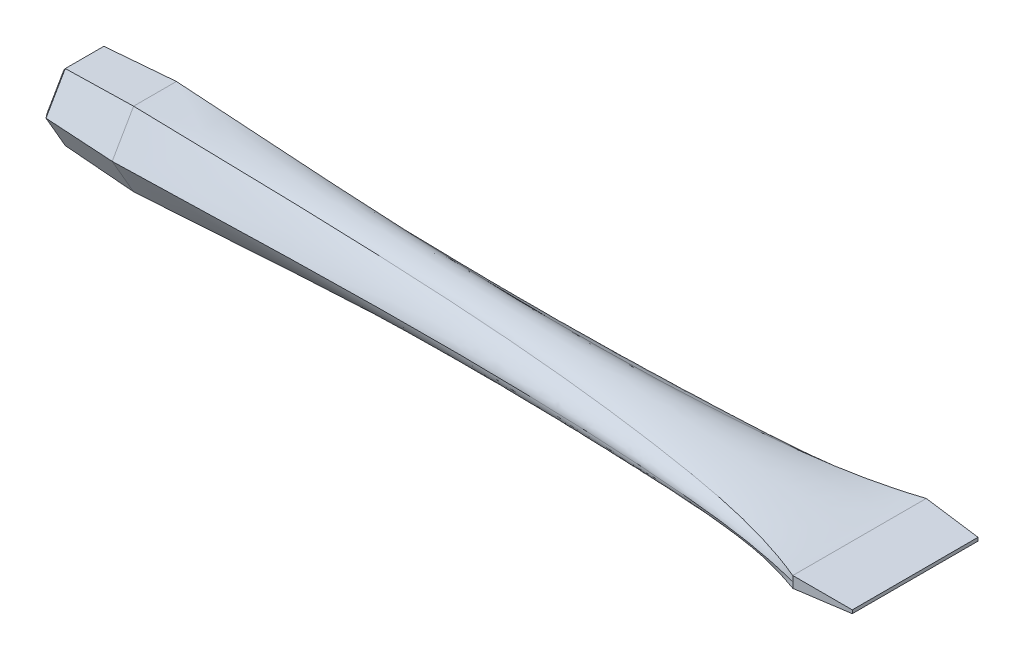
ISO-10303-21;
HEADER;
FILE_DESCRIPTION(('STEP AP214'),'2;1');
FILE_NAME('part.step','',(''),(''),'','','');
FILE_SCHEMA(('AUTOMOTIVE_DESIGN { 1 0 10303 214 1 1 1 1 }'));
ENDSEC;
DATA;
#1=APPLICATION_CONTEXT('core data for automotive mechanical design processes');
#2=APPLICATION_PROTOCOL_DEFINITION('international standard','automotive_design',2000,#1);
#3=PRODUCT_CONTEXT('',#1,'mechanical');
#4=PRODUCT('Part','Part','',(#3));
#5=PRODUCT_RELATED_PRODUCT_CATEGORY('part','',(#4));
#6=PRODUCT_DEFINITION_FORMATION('','',#4);
#7=PRODUCT_DEFINITION_CONTEXT('part definition',#1,'design');
#8=PRODUCT_DEFINITION('design','',#6,#7);
#9=PRODUCT_DEFINITION_SHAPE('','',#8);
#10=(LENGTH_UNIT() NAMED_UNIT(*) SI_UNIT(.MILLI.,.METRE.));
#11=(NAMED_UNIT(*) PLANE_ANGLE_UNIT() SI_UNIT($,.RADIAN.));
#12=(NAMED_UNIT(*) SI_UNIT($,.STERADIAN.) SOLID_ANGLE_UNIT());
#13=UNCERTAINTY_MEASURE_WITH_UNIT(LENGTH_MEASURE(1.E-05),#10,'distance_accuracy_value','');
#14=(GEOMETRIC_REPRESENTATION_CONTEXT(3) GLOBAL_UNCERTAINTY_ASSIGNED_CONTEXT((#13)) GLOBAL_UNIT_ASSIGNED_CONTEXT((#10,
#11,#12)) REPRESENTATION_CONTEXT('',''));
#15=CARTESIAN_POINT('',(0.,0.,0.));
#16=DIRECTION('',(0.,0.,1.));
#17=DIRECTION('',(1.,0.,0.));
#18=AXIS2_PLACEMENT_3D('',#15,#16,#17);
#19=CARTESIAN_POINT('',(0.,0.,11.5470053837925));
#20=CARTESIAN_POINT('',(50.0524857948005,0.,10.152627898497));
#21=CARTESIAN_POINT('',(114.191888216519,0.,7.71740943013299));
#22=CARTESIAN_POINT('',(176.719152461467,0.,14.454624309302));
#23=CARTESIAN_POINT('',(190.,0.,18.));
#24=CARTESIAN_POINT('',(0.,-3.33333333333334,9.62250448649376));
#25=CARTESIAN_POINT('',(50.0807434546291,-2.58960922456806,8.34036333428904));
#26=CARTESIAN_POINT('',(114.135882131359,-1.98688605278007,8.94009763736232));
#27=CARTESIAN_POINT('',(176.747410121296,-0.700720335679169,13.9253603432932));
#28=CARTESIAN_POINT('',(190.,-0.500000000000001,18.));
#29=CARTESIAN_POINT('',(0.,-6.66666666666667,7.69800358919501));
#30=CARTESIAN_POINT('',(50.1090011144577,-5.17921844913612,6.5280987700811));
#31=CARTESIAN_POINT('',(114.0798760462,-3.8493216600053,6.98155758950192));
#32=CARTESIAN_POINT('',(176.775667781124,-1.40144067135834,13.3960963772844));
#33=CARTESIAN_POINT('',(190.,-1.,18.));
#34=CARTESIAN_POINT('',(0.,-10.,5.77350269189626));
#35=CARTESIAN_POINT('',(50.1372587742863,-7.76882767370418,4.71583420587316));
#36=CARTESIAN_POINT('',(114.023869961041,-4.92835147361547,2.43953739263066));
#37=CARTESIAN_POINT('',(176.803925440953,-2.10216100703751,12.8668324112757));
#38=CARTESIAN_POINT('',(190.,-1.5,18.));
#39=B_SPLINE_SURFACE_WITH_KNOTS('',3,3,((#19,#20,#21,#22,#23),(#24,#25,#26,#27,#28),(#29,#30,
#31,#32,#33),(#34,#35,#36,#37,#38)),.UNSPECIFIED.,.F.,.F.,.F.,(4,4),(4,1,4),(0.,1.),(0.,
0.786925268887612,1.),.UNSPECIFIED.);
#40=DIRECTION('',(0.,-0.866025403784439,-0.5));
#41=VECTOR('',#40,1.);
#42=CARTESIAN_POINT('',(0.,0.,11.5470053837925));
#43=LINE('',#42,#41);
#44=CARTESIAN_POINT('',(0.,0.,11.5470053837925));
#45=VERTEX_POINT('',#44);
#46=CARTESIAN_POINT('',(0.,-10.,5.77350269189626));
#47=VERTEX_POINT('',#46);
#48=EDGE_CURVE('E350',#45,#47,#43,.T.);
#49=CARTESIAN_POINT('',(0.,-10.,5.77350269189626));
#50=CARTESIAN_POINT('',(50.1372587742863,-7.76882767370418,4.71583420587316));
#51=CARTESIAN_POINT('',(114.023869961041,-4.92835147361547,2.43953739263066));
#52=CARTESIAN_POINT('',(176.803925440953,-2.10216100703751,12.8668324112757));
#53=CARTESIAN_POINT('',(190.,-1.5,18.));
#54=B_SPLINE_CURVE_WITH_KNOTS('',3,(#49,#50,#51,#52,#53),.UNSPECIFIED.,.F.,.F.,(4,1,4),(0.,
0.786925268887612,1.),.UNSPECIFIED.);
#55=CARTESIAN_POINT('',(190.,-1.5,18.));
#56=VERTEX_POINT('',#55);
#57=EDGE_CURVE('E225',#47,#56,#54,.T.);
#58=DIRECTION('',(0.,-1.,0.));
#59=VECTOR('',#58,1.);
#60=CARTESIAN_POINT('',(190.,-1.5,18.));
#61=LINE('',#60,#59);
#62=CARTESIAN_POINT('',(190.,0.,18.));
#63=VERTEX_POINT('',#62);
#64=EDGE_CURVE('E525',#63,#56,#61,.T.);
#65=CARTESIAN_POINT('',(0.,0.,11.5470053837925));
#66=CARTESIAN_POINT('',(50.0524857948005,0.,10.152627898497));
#67=CARTESIAN_POINT('',(114.191888216519,0.,7.71740943013299));
#68=CARTESIAN_POINT('',(176.719152461467,0.,14.454624309302));
#69=CARTESIAN_POINT('',(190.,0.,18.));
#70=B_SPLINE_CURVE_WITH_KNOTS('',3,(#65,#66,#67,#68,#69),.UNSPECIFIED.,.F.,.F.,(4,1,4),(0.,
0.786925268887612,1.),.UNSPECIFIED.);
#71=EDGE_CURVE('E330',#63,#45,#70,.F.);
#72=ORIENTED_EDGE('',*,*,#48,.T.);
#73=ORIENTED_EDGE('',*,*,#57,.T.);
#74=ORIENTED_EDGE('',*,*,#64,.F.);
#75=ORIENTED_EDGE('',*,*,#71,.T.);
#76=EDGE_LOOP('',(#72,#73,#74,#75));
#77=FACE_BOUND('',#76,.T.);
#78=ADVANCED_FACE('F79',(#77),#39,.T.);
#79=CARTESIAN_POINT('',(0.,-10.,5.77350269189626));
#80=CARTESIAN_POINT('',(50.1372587742863,-7.76882767370417,4.71583420587316));
#81=CARTESIAN_POINT('',(114.023869961041,-4.92835147361547,2.43953739263068));
#82=CARTESIAN_POINT('',(176.803925440953,-2.10216100703751,12.8668324112757));
#83=CARTESIAN_POINT('',(190.,-1.5,18.));
#84=CARTESIAN_POINT('',(0.,-10.,5.29237746757157));
#85=CARTESIAN_POINT('',(50.1173549026115,-7.93798023263458,4.41725436959057));
#86=CARTESIAN_POINT('',(114.063319014458,-5.3953873633319,2.5874818377983));
#87=CARTESIAN_POINT('',(176.784021569278,-2.27131356596792,11.8890027245429));
#88=CARTESIAN_POINT('',(190.,-1.5,16.5));
#89=CARTESIAN_POINT('',(0.,-10.,4.3301270189222));
#90=CARTESIAN_POINT('',(50.0775471592618,-8.27628535049541,3.8200946970254));
#91=CARTESIAN_POINT('',(114.142217121291,-6.15790110732662,2.49949383465914));
#92=CARTESIAN_POINT('',(176.744213825929,-2.60961868382873,9.93334335107729));
#93=CARTESIAN_POINT('',(190.,-1.5,13.5));
#94=CARTESIAN_POINT('',(0.,-10.,2.40562612162344));
#95=CARTESIAN_POINT('',(50.0356832500862,-8.74467977681688,2.29121854053672));
#96=CARTESIAN_POINT('',(114.225190505381,-7.3524067559934,1.87035221919839));
#97=CARTESIAN_POINT('',(176.702349916753,-3.07801311015022,5.68746779278777));
#98=CARTESIAN_POINT('',(190.,-1.5,7.50000000000002));
#99=CARTESIAN_POINT('',(0.,-9.99999999999999,0.));
#100=CARTESIAN_POINT('',(50.0186474363685,-9.00799071015255,-0.000325483374910612));
#101=CARTESIAN_POINT('',(114.258955128481,-7.98233038199574,-0.000825329718284887));
#102=CARTESIAN_POINT('',(176.685314103035,-3.34132404348589,-0.000325483374901483));
#103=CARTESIAN_POINT('',(190.,-1.5,0.));
#104=CARTESIAN_POINT('',(0.,-10.,-2.40562612162344));
#105=CARTESIAN_POINT('',(50.0356933414433,-8.74473720505389,-2.29058757182598));
#106=CARTESIAN_POINT('',(114.225170504523,-7.35254870712392,-1.86873682059862));
#107=CARTESIAN_POINT('',(176.70236000811,-3.07807053838723,-5.686836824077));
#108=CARTESIAN_POINT('',(190.,-1.5,-7.49999999999998));
#109=CARTESIAN_POINT('',(0.,-10.,-4.33012701892219));
#110=CARTESIAN_POINT('',(50.0775459811207,-8.27629377709765,-3.82019822009269));
#111=CARTESIAN_POINT('',(114.142219456343,-6.15792748057585,-2.49982203523418));
#112=CARTESIAN_POINT('',(176.744212647787,-2.60962711043098,-9.93344687414455));
#113=CARTESIAN_POINT('',(190.,-1.5,-13.5));
#114=CARTESIAN_POINT('',(0.,-10.,-5.29237746757157));
#115=CARTESIAN_POINT('',(50.1173545098978,-7.937983041502,-4.41728887727967));
#116=CARTESIAN_POINT('',(114.063319792808,-5.39538179621599,-2.58741344428715));
#117=CARTESIAN_POINT('',(176.784021176564,-2.27131637483533,-11.8890372322319));
#118=CARTESIAN_POINT('',(190.,-1.5,-16.5));
#119=CARTESIAN_POINT('',(0.,-10.,-5.77350269189626));
#120=CARTESIAN_POINT('',(50.1372587742863,-7.76882767370418,-4.71583420587317));
#121=CARTESIAN_POINT('',(114.023869961041,-4.92835147361547,-2.43953739263071));
#122=CARTESIAN_POINT('',(176.803925440953,-2.10216100703751,-12.8668324112756));
#123=CARTESIAN_POINT('',(190.,-1.5,-18.));
#124=B_SPLINE_SURFACE_WITH_KNOTS('',3,3,((#79,#80,#81,#82,#83),(#84,#85,#86,#87,#88),(#89,#90,
#91,#92,#93),(#94,#95,#96,#97,#98),(#99,#100,#101,#102,#103),(#104,#105,#106,#107,#108),(#109,
#110,#111,#112,#113),(#114,#115,#116,#117,#118),(#119,#120,#121,#122,#123)),.UNSPECIFIED.,.F.,
.F.,.F.,(4,1,1,1,1,1,4),(4,1,4),(0.,0.125,0.25,0.5,0.75,0.875,1.),(0.,0.786925268887612,1.),.UNSPECIFIED.);
#125=DIRECTION('',(0.,0.,-1.));
#126=VECTOR('',#125,1.);
#127=CARTESIAN_POINT('',(0.,-10.,5.77350269189626));
#128=LINE('',#127,#126);
#129=CARTESIAN_POINT('',(0.,-10.,-5.77350269189626));
#130=VERTEX_POINT('',#129);
#131=EDGE_CURVE('E338',#47,#130,#128,.T.);
#132=CARTESIAN_POINT('',(0.,-10.,-5.77350269189626));
#133=CARTESIAN_POINT('',(50.1372587742863,-7.76882767370418,-4.71583420587317));
#134=CARTESIAN_POINT('',(114.023869961041,-4.92835147361547,-2.43953739263071));
#135=CARTESIAN_POINT('',(176.803925440953,-2.10216100703751,-12.8668324112756));
#136=CARTESIAN_POINT('',(190.,-1.5,-18.));
#137=B_SPLINE_CURVE_WITH_KNOTS('',3,(#132,#133,#134,#135,#136),.UNSPECIFIED.,.F.,.F.,(4,1,4),
(0.,0.786925268887612,1.),.UNSPECIFIED.);
#138=CARTESIAN_POINT('',(190.,-1.5,-18.));
#139=VERTEX_POINT('',#138);
#140=EDGE_CURVE('E210',#130,#139,#137,.T.);
#141=DIRECTION('',(0.,0.,-1.));
#142=VECTOR('',#141,1.);
#143=CARTESIAN_POINT('',(190.,-1.5,-18.));
#144=LINE('',#143,#142);
#145=EDGE_CURVE('E384',#56,#139,#144,.T.);
#146=ORIENTED_EDGE('',*,*,#131,.T.);
#147=ORIENTED_EDGE('',*,*,#140,.T.);
#148=ORIENTED_EDGE('',*,*,#145,.F.);
#149=ORIENTED_EDGE('',*,*,#57,.F.);
#150=EDGE_LOOP('',(#146,#147,#148,#149));
#151=FACE_BOUND('',#150,.T.);
#152=ADVANCED_FACE('F312',(#151),#124,.T.);
#153=CARTESIAN_POINT('',(0.,10.,5.77350269189626));
#154=CARTESIAN_POINT('',(50.1372587742863,7.76882767370418,4.71583420587316));
#155=CARTESIAN_POINT('',(114.023869961041,4.92835147361548,2.43953739263066));
#156=CARTESIAN_POINT('',(176.803925440953,2.10216100703751,12.8668324112757));
#157=CARTESIAN_POINT('',(190.,1.5,18.));
#158=CARTESIAN_POINT('',(0.,6.66666666666667,7.69800358919501));
#159=CARTESIAN_POINT('',(50.1090011144577,5.17921844913612,6.5280987700811));
#160=CARTESIAN_POINT('',(114.0798760462,3.8493216600053,6.98155758950192));
#161=CARTESIAN_POINT('',(176.775667781124,1.40144067135834,13.3960963772844));
#162=CARTESIAN_POINT('',(190.,0.999999999999998,18.));
#163=CARTESIAN_POINT('',(0.,3.33333333333334,9.62250448649376));
#164=CARTESIAN_POINT('',(50.0807434546291,2.58960922456806,8.34036333428904));
#165=CARTESIAN_POINT('',(114.135882131359,1.98688605278007,8.94009763736232));
#166=CARTESIAN_POINT('',(176.747410121296,0.700720335679169,13.9253603432932));
#167=CARTESIAN_POINT('',(190.,0.499999999999999,18.));
#168=CARTESIAN_POINT('',(0.,0.,11.5470053837925));
#169=CARTESIAN_POINT('',(50.0524857948005,0.,10.152627898497));
#170=CARTESIAN_POINT('',(114.191888216519,0.,7.71740943013299));
#171=CARTESIAN_POINT('',(176.719152461467,0.,14.454624309302));
#172=CARTESIAN_POINT('',(190.,0.,18.));
#173=B_SPLINE_SURFACE_WITH_KNOTS('',3,3,((#153,#154,#155,#156,#157),(#158,#159,#160,#161,#162),
(#163,#164,#165,#166,#167),(#168,#169,#170,#171,#172)),.UNSPECIFIED.,.F.,.F.,.F.,(4,4),(4,1,4),
(0.,1.),(0.,0.786925268887612,1.),.UNSPECIFIED.);
#174=DIRECTION('',(0.,-0.866025403784438,0.5));
#175=VECTOR('',#174,1.);
#176=CARTESIAN_POINT('',(0.,10.,5.77350269189626));
#177=LINE('',#176,#175);
#178=CARTESIAN_POINT('',(0.,10.,5.77350269189626));
#179=VERTEX_POINT('',#178);
#180=EDGE_CURVE('E614',#179,#45,#177,.T.);
#181=DIRECTION('',(0.,-1.,0.));
#182=VECTOR('',#181,1.);
#183=CARTESIAN_POINT('',(190.,0.,18.));
#184=LINE('',#183,#182);
#185=CARTESIAN_POINT('',(190.,1.5,18.));
#186=VERTEX_POINT('',#185);
#187=EDGE_CURVE('E296',#186,#63,#184,.T.);
#188=CARTESIAN_POINT('',(0.,10.,5.77350269189626));
#189=CARTESIAN_POINT('',(50.1372587742863,7.76882767370418,4.71583420587316));
#190=CARTESIAN_POINT('',(114.023869961041,4.92835147361548,2.43953739263067));
#191=CARTESIAN_POINT('',(176.803925440953,2.10216100703751,12.8668324112757));
#192=CARTESIAN_POINT('',(190.,1.5,18.));
#193=B_SPLINE_CURVE_WITH_KNOTS('',3,(#188,#189,#190,#191,#192),.UNSPECIFIED.,.F.,.F.,(4,1,4),
(0.,0.786925268887612,1.),.UNSPECIFIED.);
#194=EDGE_CURVE('E223',#179,#186,#193,.T.);
#195=ORIENTED_EDGE('',*,*,#180,.T.);
#196=ORIENTED_EDGE('',*,*,#71,.F.);
#197=ORIENTED_EDGE('',*,*,#187,.F.);
#198=ORIENTED_EDGE('',*,*,#194,.F.);
#199=EDGE_LOOP('',(#195,#196,#197,#198));
#200=FACE_BOUND('',#199,.T.);
#201=ADVANCED_FACE('F301',(#200),#173,.T.);
#202=CARTESIAN_POINT('',(0.,-10.,-5.77350269189626));
#203=CARTESIAN_POINT('',(50.1372587742863,-7.76882767370418,-4.71583420587317));
#204=CARTESIAN_POINT('',(114.023869961041,-4.92835147361547,-2.4395373926307));
#205=CARTESIAN_POINT('',(176.803925440953,-2.10216100703751,-12.8668324112756));
#206=CARTESIAN_POINT('',(190.,-1.5,-18.));
#207=CARTESIAN_POINT('',(0.,-6.66666666666667,-7.69800358919501));
#208=CARTESIAN_POINT('',(50.1090011144577,-5.17921844913612,-6.52809877008111));
#209=CARTESIAN_POINT('',(114.0798760462,-3.8493216600053,-6.98155758950195));
#210=CARTESIAN_POINT('',(176.775667781124,-1.40144067135834,-13.3960963772844));
#211=CARTESIAN_POINT('',(190.,-1.,-18.));
#212=CARTESIAN_POINT('',(0.,-3.33333333333334,-9.62250448649377));
#213=CARTESIAN_POINT('',(50.0807434546291,-2.58960922456806,-8.34036333428905));
#214=CARTESIAN_POINT('',(114.135882131359,-1.98688605278007,-8.94009763736234));
#215=CARTESIAN_POINT('',(176.747410121296,-0.700720335679169,-13.9253603432932));
#216=CARTESIAN_POINT('',(190.,-0.5,-18.));
#217=CARTESIAN_POINT('',(0.,0.,-11.5470053837925));
#218=CARTESIAN_POINT('',(50.0524857948005,0.,-10.152627898497));
#219=CARTESIAN_POINT('',(114.191888216519,0.,-7.71740943013301));
#220=CARTESIAN_POINT('',(176.719152461467,0.,-14.454624309302));
#221=CARTESIAN_POINT('',(190.,0.,-18.));
#222=B_SPLINE_SURFACE_WITH_KNOTS('',3,3,((#202,#203,#204,#205,#206),(#207,#208,#209,#210,#211),
(#212,#213,#214,#215,#216),(#217,#218,#219,#220,#221)),.UNSPECIFIED.,.F.,.F.,.F.,(4,4),(4,1,4),
(0.,1.),(0.,0.786925268887612,1.),.UNSPECIFIED.);
#223=DIRECTION('',(0.,0.866025403784438,-0.5));
#224=VECTOR('',#223,1.);
#225=CARTESIAN_POINT('',(0.,-10.,-5.77350269189626));
#226=LINE('',#225,#224);
#227=CARTESIAN_POINT('',(0.,0.,-11.5470053837925));
#228=VERTEX_POINT('',#227);
#229=EDGE_CURVE('E183',#130,#228,#226,.T.);
#230=CARTESIAN_POINT('',(0.,0.,-11.5470053837925));
#231=CARTESIAN_POINT('',(50.0524857948005,0.,-10.152627898497));
#232=CARTESIAN_POINT('',(114.191888216519,0.,-7.71740943013301));
#233=CARTESIAN_POINT('',(176.719152461467,0.,-14.454624309302));
#234=CARTESIAN_POINT('',(190.,0.,-18.));
#235=B_SPLINE_CURVE_WITH_KNOTS('',3,(#230,#231,#232,#233,#234),.UNSPECIFIED.,.F.,.F.,(4,1,4),
(0.,0.786925268887612,1.),.UNSPECIFIED.);
#236=CARTESIAN_POINT('',(190.,0.,-18.));
#237=VERTEX_POINT('',#236);
#238=EDGE_CURVE('E207',#228,#237,#235,.T.);
#239=DIRECTION('',(0.,1.,0.));
#240=VECTOR('',#239,1.);
#241=CARTESIAN_POINT('',(190.,-1.5,-18.));
#242=LINE('',#241,#240);
#243=EDGE_CURVE('E394',#139,#237,#242,.T.);
#244=ORIENTED_EDGE('',*,*,#229,.T.);
#245=ORIENTED_EDGE('',*,*,#238,.T.);
#246=ORIENTED_EDGE('',*,*,#243,.F.);
#247=ORIENTED_EDGE('',*,*,#140,.F.);
#248=EDGE_LOOP('',(#244,#245,#246,#247));
#249=FACE_BOUND('',#248,.T.);
#250=ADVANCED_FACE('F206',(#249),#222,.T.);
#251=CARTESIAN_POINT('',(0.,0.,-11.5470053837925));
#252=CARTESIAN_POINT('',(50.0524857948005,0.,-10.152627898497));
#253=CARTESIAN_POINT('',(114.191888216519,0.,-7.71740943013301));
#254=CARTESIAN_POINT('',(176.719152461467,0.,-14.454624309302));
#255=CARTESIAN_POINT('',(190.,0.,-18.));
#256=CARTESIAN_POINT('',(0.,3.33333333333333,-9.62250448649377));
#257=CARTESIAN_POINT('',(50.0807434546291,2.58960922456806,-8.34036333428906));
#258=CARTESIAN_POINT('',(114.135882131359,1.98688605278006,-8.94009763736234));
#259=CARTESIAN_POINT('',(176.747410121296,0.700720335679168,-13.9253603432932));
#260=CARTESIAN_POINT('',(190.,0.5,-18.));
#261=CARTESIAN_POINT('',(0.,6.66666666666667,-7.69800358919502));
#262=CARTESIAN_POINT('',(50.1090011144577,5.17921844913611,-6.52809877008112));
#263=CARTESIAN_POINT('',(114.0798760462,3.84932166000529,-6.98155758950195));
#264=CARTESIAN_POINT('',(176.775667781124,1.40144067135834,-13.3960963772844));
#265=CARTESIAN_POINT('',(190.,1.,-18.));
#266=CARTESIAN_POINT('',(0.,10.,-5.77350269189627));
#267=CARTESIAN_POINT('',(50.1372587742863,7.76882767370418,-4.71583420587318));
#268=CARTESIAN_POINT('',(114.023869961041,4.92835147361547,-2.43953739263071));
#269=CARTESIAN_POINT('',(176.803925440953,2.1021610070375,-12.8668324112757));
#270=CARTESIAN_POINT('',(190.,1.5,-18.));
#271=B_SPLINE_SURFACE_WITH_KNOTS('',3,3,((#251,#252,#253,#254,#255),(#256,#257,#258,#259,#260),
(#261,#262,#263,#264,#265),(#266,#267,#268,#269,#270)),.UNSPECIFIED.,.F.,.F.,.F.,(4,4),(4,1,4),
(0.,1.),(0.,0.786925268887612,1.),.UNSPECIFIED.);
#272=DIRECTION('',(0.,0.866025403784439,0.5));
#273=VECTOR('',#272,1.);
#274=CARTESIAN_POINT('',(0.,0.,-11.5470053837925));
#275=LINE('',#274,#273);
#276=CARTESIAN_POINT('',(0.,10.,-5.77350269189627));
#277=VERTEX_POINT('',#276);
#278=EDGE_CURVE('E191',#228,#277,#275,.T.);
#279=CARTESIAN_POINT('',(0.,10.,-5.77350269189627));
#280=CARTESIAN_POINT('',(50.1372587742863,7.76882767370418,-4.71583420587318));
#281=CARTESIAN_POINT('',(114.023869961041,4.92835147361547,-2.43953739263071));
#282=CARTESIAN_POINT('',(176.803925440953,2.1021610070375,-12.8668324112757));
#283=CARTESIAN_POINT('',(190.,1.5,-18.));
#284=B_SPLINE_CURVE_WITH_KNOTS('',3,(#279,#280,#281,#282,#283),.UNSPECIFIED.,.F.,.F.,(4,1,4),
(0.,0.786925268887612,1.),.UNSPECIFIED.);
#285=CARTESIAN_POINT('',(190.,1.5,-18.));
#286=VERTEX_POINT('',#285);
#287=EDGE_CURVE('E221',#277,#286,#284,.T.);
#288=DIRECTION('',(0.,1.,0.));
#289=VECTOR('',#288,1.);
#290=CARTESIAN_POINT('',(190.,0.,-18.));
#291=LINE('',#290,#289);
#292=EDGE_CURVE('E218',#237,#286,#291,.T.);
#293=ORIENTED_EDGE('',*,*,#278,.T.);
#294=ORIENTED_EDGE('',*,*,#287,.T.);
#295=ORIENTED_EDGE('',*,*,#292,.F.);
#296=ORIENTED_EDGE('',*,*,#238,.F.);
#297=EDGE_LOOP('',(#293,#294,#295,#296));
#298=FACE_BOUND('',#297,.T.);
#299=ADVANCED_FACE('F216',(#298),#271,.T.);
#300=CARTESIAN_POINT('',(0.,10.,-5.77350269189627));
#301=CARTESIAN_POINT('',(50.1372587742863,7.76882767370417,-4.71583420587318));
#302=CARTESIAN_POINT('',(114.023869961041,4.92835147361547,-2.43953739263071));
#303=CARTESIAN_POINT('',(176.803925440953,2.1021610070375,-12.8668324112757));
#304=CARTESIAN_POINT('',(190.,1.5,-18.));
#305=CARTESIAN_POINT('',(0.,10.,-5.29237746757158));
#306=CARTESIAN_POINT('',(50.1173549026115,7.93798023263458,-4.4172543695906));
#307=CARTESIAN_POINT('',(114.063319014458,5.39538736333189,-2.58748183779834));
#308=CARTESIAN_POINT('',(176.784021569278,2.27131356596791,-11.8890027245429));
#309=CARTESIAN_POINT('',(190.,1.5,-16.5));
#310=CARTESIAN_POINT('',(0.,10.,-4.3301270189222));
#311=CARTESIAN_POINT('',(50.0775471592619,8.2762853504954,-3.82009469702542));
#312=CARTESIAN_POINT('',(114.142217121292,6.15790110732661,-2.4994938346592));
#313=CARTESIAN_POINT('',(176.744213825929,2.60961868382873,-9.93334335107728));
#314=CARTESIAN_POINT('',(190.,1.5,-13.5));
#315=CARTESIAN_POINT('',(0.,10.,-2.40562612162345));
#316=CARTESIAN_POINT('',(50.035683250086,8.74467977681688,-2.29121854053674));
#317=CARTESIAN_POINT('',(114.225190505379,7.3524067559934,-1.87035221919841));
#318=CARTESIAN_POINT('',(176.702349916753,3.07801311015021,-5.68746779278774));
#319=CARTESIAN_POINT('',(190.,1.5,-7.49999999999998));
#320=CARTESIAN_POINT('',(0.,9.99999999999999,0.));
#321=CARTESIAN_POINT('',(50.0186474363685,9.00799071015255,0.000325483374885734));
#322=CARTESIAN_POINT('',(114.258955128482,7.98233038199575,0.000825329718225219));
#323=CARTESIAN_POINT('',(176.685314103035,3.34132404348589,0.000325483374897801));
#324=CARTESIAN_POINT('',(190.,1.5,0.));
#325=CARTESIAN_POINT('',(0.,10.,2.40562612162344));
#326=CARTESIAN_POINT('',(50.0356933414433,8.74473720505391,2.29058757182596));
#327=CARTESIAN_POINT('',(114.225170504523,7.35254870712393,1.86873682059855));
#328=CARTESIAN_POINT('',(176.70236000811,3.07807053838724,5.68683682407702));
#329=CARTESIAN_POINT('',(190.,1.5,7.50000000000002));
#330=CARTESIAN_POINT('',(0.,10.,4.33012701892219));
#331=CARTESIAN_POINT('',(50.0775459811207,8.27629377709764,3.82019822009267));
#332=CARTESIAN_POINT('',(114.142219456343,6.15792748057584,2.49982203523413));
#333=CARTESIAN_POINT('',(176.744212647787,2.60962711043097,9.93344687414455));
#334=CARTESIAN_POINT('',(190.,1.5,13.5));
#335=CARTESIAN_POINT('',(0.,10.,5.29237746757157));
#336=CARTESIAN_POINT('',(50.1173545098978,7.937983041502,4.41728887727966));
#337=CARTESIAN_POINT('',(114.063319792808,5.395381796216,2.5874134442871));
#338=CARTESIAN_POINT('',(176.784021176564,2.27131637483533,11.889037232232));
#339=CARTESIAN_POINT('',(190.,1.5,16.5));
#340=CARTESIAN_POINT('',(0.,10.,5.77350269189626));
#341=CARTESIAN_POINT('',(50.1372587742863,7.76882767370418,4.71583420587316));
#342=CARTESIAN_POINT('',(114.023869961041,4.92835147361548,2.43953739263067));
#343=CARTESIAN_POINT('',(176.803925440953,2.10216100703751,12.8668324112757));
#344=CARTESIAN_POINT('',(190.,1.5,18.));
#345=B_SPLINE_SURFACE_WITH_KNOTS('',3,3,((#300,#301,#302,#303,#304),(#305,#306,#307,#308,#309),
(#310,#311,#312,#313,#314),(#315,#316,#317,#318,#319),(#320,#321,#322,#323,#324),(#325,#326,
#327,#328,#329),(#330,#331,#332,#333,#334),(#335,#336,#337,#338,#339),(#340,#341,#342,#343,
#344)),.UNSPECIFIED.,.F.,.F.,.F.,(4,1,1,1,1,1,4),(4,1,4),(0.,0.125,0.25,0.5,0.75,0.875,1.),(0.,
0.786925268887612,1.),.UNSPECIFIED.);
#346=DIRECTION('',(0.,0.,1.));
#347=VECTOR('',#346,1.);
#348=CARTESIAN_POINT('',(0.,10.,-5.77350269189627));
#349=LINE('',#348,#347);
#350=EDGE_CURVE('E200',#277,#179,#349,.T.);
#351=DIRECTION('',(0.,0.,1.));
#352=VECTOR('',#351,1.);
#353=CARTESIAN_POINT('',(190.,1.5,-18.));
#354=LINE('',#353,#352);
#355=EDGE_CURVE('E282',#286,#186,#354,.T.);
#356=ORIENTED_EDGE('',*,*,#350,.T.);
#357=ORIENTED_EDGE('',*,*,#194,.T.);
#358=ORIENTED_EDGE('',*,*,#355,.F.);
#359=ORIENTED_EDGE('',*,*,#287,.F.);
#360=EDGE_LOOP('',(#356,#357,#358,#359));
#361=FACE_BOUND('',#360,.T.);
#362=ADVANCED_FACE('F252',(#361),#345,.T.);
#363=CARTESIAN_POINT('',(190.,1.5,-18.));
#364=DIRECTION('',(0.0697564737441256,0.997564050259824,0.));
#365=DIRECTION('',(-0.997564050259824,0.0697564737441256,0.));
#366=AXIS2_PLACEMENT_3D('',#363,#364,#365);
#367=PLANE('',#366);
#368=ORIENTED_EDGE('',*,*,#355,.T.);
#369=DIRECTION('',(-0.995145815783508,0.069587374316665,0.069587374316665));
#370=VECTOR('',#369,1.);
#371=CARTESIAN_POINT('',(190.103874376574,1.49273639600357,17.9927363960036));
#372=LINE('',#371,#370);
#373=CARTESIAN_POINT('',(205.,0.451097820847335,16.9510978208474));
#374=VERTEX_POINT('',#373);
#375=EDGE_CURVE('E554',#374,#186,#372,.T.);
#376=ORIENTED_EDGE('',*,*,#375,.F.);
#377=DIRECTION('',(0.,0.,-1.));
#378=VECTOR('',#377,1.);
#379=CARTESIAN_POINT('',(205.,0.451097820847338,-18.));
#380=LINE('',#379,#378);
#381=CARTESIAN_POINT('',(205.,0.451097820847338,-16.9510978208473));
#382=VERTEX_POINT('',#381);
#383=EDGE_CURVE('E828',#382,#374,#380,.F.);
#384=ORIENTED_EDGE('',*,*,#383,.F.);
#385=DIRECTION('',(-0.995145815783508,0.069587374316665,-0.069587374316665));
#386=VECTOR('',#385,1.);
#387=CARTESIAN_POINT('',(190.,1.5,-18.));
#388=LINE('',#387,#386);
#389=EDGE_CURVE('E212',#382,#286,#388,.T.);
#390=ORIENTED_EDGE('',*,*,#389,.T.);
#391=EDGE_LOOP('',(#368,#376,#384,#390));
#392=FACE_BOUND('',#391,.T.);
#393=ADVANCED_FACE('F506',(#392),#367,.T.);
#394=CARTESIAN_POINT('',(190.,0.,18.));
#395=DIRECTION('',(0.0697564737441256,0.,0.997564050259824));
#396=DIRECTION('',(0.997564050259824,0.,-0.0697564737441256));
#397=AXIS2_PLACEMENT_3D('',#394,#395,#396);
#398=PLANE('',#397);
#399=ORIENTED_EDGE('',*,*,#187,.T.);
#400=ORIENTED_EDGE('',*,*,#64,.T.);
#401=DIRECTION('',(-0.995145815783508,-0.069587374316665,0.069587374316665));
#402=VECTOR('',#401,1.);
#403=CARTESIAN_POINT('',(190.,-1.5,18.));
#404=LINE('',#403,#402);
#405=CARTESIAN_POINT('',(205.,-0.45109782084734,16.9510978208474));
#406=VERTEX_POINT('',#405);
#407=EDGE_CURVE('E526',#406,#56,#404,.T.);
#408=ORIENTED_EDGE('',*,*,#407,.F.);
#409=DIRECTION('',(0.,1.,0.));
#410=VECTOR('',#409,1.);
#411=CARTESIAN_POINT('',(205.,0.,16.9510978208474));
#412=LINE('',#411,#410);
#413=EDGE_CURVE('E836',#374,#406,#412,.F.);
#414=ORIENTED_EDGE('',*,*,#413,.F.);
#415=ORIENTED_EDGE('',*,*,#375,.T.);
#416=EDGE_LOOP('',(#399,#400,#408,#414,#415));
#417=FACE_BOUND('',#416,.T.);
#418=ADVANCED_FACE('F364',(#417),#398,.T.);
#419=CARTESIAN_POINT('',(190.,-1.5,18.));
#420=DIRECTION('',(0.0697564737441256,-0.997564050259824,0.));
#421=DIRECTION('',(0.997564050259824,0.0697564737441256,0.));
#422=AXIS2_PLACEMENT_3D('',#419,#420,#421);
#423=PLANE('',#422);
#424=ORIENTED_EDGE('',*,*,#145,.T.);
#425=DIRECTION('',(-0.995145815783508,-0.069587374316665,-0.069587374316665));
#426=VECTOR('',#425,1.);
#427=CARTESIAN_POINT('',(190.,-1.5,-18.));
#428=LINE('',#427,#426);
#429=CARTESIAN_POINT('',(205.,-0.451097820847338,-16.9510978208473));
#430=VERTEX_POINT('',#429);
#431=EDGE_CURVE('E840',#430,#139,#428,.T.);
#432=ORIENTED_EDGE('',*,*,#431,.F.);
#433=DIRECTION('',(0.,0.,1.));
#434=VECTOR('',#433,1.);
#435=CARTESIAN_POINT('',(205.,-0.45109782084734,18.));
#436=LINE('',#435,#434);
#437=EDGE_CURVE('E830',#406,#430,#436,.F.);
#438=ORIENTED_EDGE('',*,*,#437,.F.);
#439=ORIENTED_EDGE('',*,*,#407,.T.);
#440=EDGE_LOOP('',(#424,#432,#438,#439));
#441=FACE_BOUND('',#440,.T.);
#442=ADVANCED_FACE('F505',(#441),#423,.T.);
#443=CARTESIAN_POINT('',(190.,-1.5,-18.));
#444=DIRECTION('',(0.0697564737441256,0.,-0.997564050259824));
#445=DIRECTION('',(-0.997564050259824,0.,-0.0697564737441256));
#446=AXIS2_PLACEMENT_3D('',#443,#444,#445);
#447=PLANE('',#446);
#448=ORIENTED_EDGE('',*,*,#243,.T.);
#449=ORIENTED_EDGE('',*,*,#292,.T.);
#450=ORIENTED_EDGE('',*,*,#389,.F.);
#451=DIRECTION('',(0.,-1.,0.));
#452=VECTOR('',#451,1.);
#453=CARTESIAN_POINT('',(205.,-1.5,-16.9510978208473));
#454=LINE('',#453,#452);
#455=EDGE_CURVE('E187',#430,#382,#454,.F.);
#456=ORIENTED_EDGE('',*,*,#455,.F.);
#457=ORIENTED_EDGE('',*,*,#431,.T.);
#458=EDGE_LOOP('',(#448,#449,#450,#456,#457));
#459=FACE_BOUND('',#458,.T.);
#460=ADVANCED_FACE('F495',(#459),#447,.T.);
#461=CARTESIAN_POINT('',(205.,0.,0.));
#462=DIRECTION('',(1.,0.,0.));
#463=DIRECTION('',(0.,0.,-1.));
#464=AXIS2_PLACEMENT_3D('',#461,#462,#463);
#465=PLANE('',#464);
#466=ORIENTED_EDGE('',*,*,#455,.T.);
#467=ORIENTED_EDGE('',*,*,#383,.T.);
#468=ORIENTED_EDGE('',*,*,#413,.T.);
#469=ORIENTED_EDGE('',*,*,#437,.T.);
#470=EDGE_LOOP('',(#466,#467,#468,#469));
#471=FACE_BOUND('',#470,.T.);
#472=ADVANCED_FACE('F504',(#471),#465,.T.);
#473=CARTESIAN_POINT('',(0.,10.,-5.77350269189627));
#474=DIRECTION('',(-0.0523359562429439,0.499314767377287,-0.864838546066896));
#475=DIRECTION('',(0.,0.866025403784439,0.5));
#476=AXIS2_PLACEMENT_3D('',#473,#474,#475);
#477=PLANE('',#476);
#478=DIRECTION('',(0.99817396359918,0.,-0.0604047878293017));
#479=VECTOR('',#478,1.);
#480=CARTESIAN_POINT('',(0.,0.,-11.5470053837925));
#481=LINE('',#480,#479);
#482=CARTESIAN_POINT('',(-19.0013704652454,0.,-10.3971319215751));
#483=VERTEX_POINT('',#482);
#484=EDGE_CURVE('E179',#483,#228,#481,.T.);
#485=ORIENTED_EDGE('',*,*,#484,.F.);
#486=DIRECTION('',(0.,-0.866025403784439,-0.5));
#487=VECTOR('',#486,1.);
#488=CARTESIAN_POINT('',(-19.0013704652454,8.97801239246065,-5.21367405000012));
#489=LINE('',#488,#487);
#490=CARTESIAN_POINT('',(-19.0013704652454,9.00418037058212,-5.19856596078754));
#491=VERTEX_POINT('',#490);
#492=EDGE_CURVE('E88',#483,#491,#489,.F.);
#493=ORIENTED_EDGE('',*,*,#492,.T.);
#494=DIRECTION('',(0.99817396359918,0.0523120807703844,-0.0302023939146509));
#495=VECTOR('',#494,1.);
#496=CARTESIAN_POINT('',(0.,10.,-5.77350269189627));
#497=LINE('',#496,#495);
#498=EDGE_CURVE('E194',#491,#277,#497,.T.);
#499=ORIENTED_EDGE('',*,*,#498,.T.);
#500=ORIENTED_EDGE('',*,*,#278,.F.);
#501=EDGE_LOOP('',(#485,#493,#499,#500));
#502=FACE_BOUND('',#501,.T.);
#503=ADVANCED_FACE('F193',(#502),#477,.T.);
#504=CARTESIAN_POINT('',(0.,0.,-11.5470053837925));
#505=DIRECTION('',(-0.0523359562429439,-0.499314767377287,-0.864838546066896));
#506=DIRECTION('',(0.,0.866025403784438,-0.5));
#507=AXIS2_PLACEMENT_3D('',#504,#505,#506);
#508=PLANE('',#507);
#509=DIRECTION('',(0.99817396359918,-0.0523120807703844,-0.0302023939146508));
#510=VECTOR('',#509,1.);
#511=CARTESIAN_POINT('',(0.,-10.,-5.77350269189626));
#512=LINE('',#511,#510);
#513=CARTESIAN_POINT('',(-19.0013704652454,-9.00418037058213,-5.19856596078753));
#514=VERTEX_POINT('',#513);
#515=EDGE_CURVE('E188',#514,#130,#512,.T.);
#516=ORIENTED_EDGE('',*,*,#515,.F.);
#517=DIRECTION('',(0.,-0.866025403784439,0.5));
#518=VECTOR('',#517,1.);
#519=CARTESIAN_POINT('',(-19.0013704652454,-0.0261679781214735,-10.3820238323625));
#520=LINE('',#519,#518);
#521=EDGE_CURVE('E103',#514,#483,#520,.F.);
#522=ORIENTED_EDGE('',*,*,#521,.T.);
#523=ORIENTED_EDGE('',*,*,#484,.T.);
#524=ORIENTED_EDGE('',*,*,#229,.F.);
#525=EDGE_LOOP('',(#516,#522,#523,#524));
#526=FACE_BOUND('',#525,.T.);
#527=ADVANCED_FACE('F181',(#526),#508,.T.);
#528=CARTESIAN_POINT('',(0.,-10.,-5.77350269189626));
#529=DIRECTION('',(-0.0523359562429439,-0.998629534754574,0.));
#530=DIRECTION('',(0.998629534754574,-0.052335956242944,0.));
#531=AXIS2_PLACEMENT_3D('',#528,#529,#530);
#532=PLANE('',#531);
#533=DIRECTION('',(0.99817396359918,-0.0523120807703843,0.0302023939146509));
#534=VECTOR('',#533,1.);
#535=CARTESIAN_POINT('',(0.,-10.,5.77350269189626));
#536=LINE('',#535,#534);
#537=CARTESIAN_POINT('',(-19.0013704652454,-9.00418037058212,5.19856596078753));
#538=VERTEX_POINT('',#537);
#539=EDGE_CURVE('E459',#538,#47,#536,.T.);
#540=ORIENTED_EDGE('',*,*,#539,.F.);
#541=DIRECTION('',(0.,0.,1.));
#542=VECTOR('',#541,1.);
#543=CARTESIAN_POINT('',(-19.0013704652454,-9.00418037058212,-5.16834978236237));
#544=LINE('',#543,#542);
#545=EDGE_CURVE('E462',#538,#514,#544,.F.);
#546=ORIENTED_EDGE('',*,*,#545,.T.);
#547=ORIENTED_EDGE('',*,*,#515,.T.);
#548=ORIENTED_EDGE('',*,*,#131,.F.);
#549=EDGE_LOOP('',(#540,#546,#547,#548));
#550=FACE_BOUND('',#549,.T.);
#551=ADVANCED_FACE('F432',(#550),#532,.T.);
#552=CARTESIAN_POINT('',(0.,-10.,5.77350269189626));
#553=DIRECTION('',(-0.0523359562429439,-0.499314767377287,0.864838546066896));
#554=DIRECTION('',(0.,-0.866025403784439,-0.5));
#555=AXIS2_PLACEMENT_3D('',#552,#553,#554);
#556=PLANE('',#555);
#557=DIRECTION('',(0.99817396359918,0.,0.0604047878293017));
#558=VECTOR('',#557,1.);
#559=CARTESIAN_POINT('',(0.,0.,11.5470053837925));
#560=LINE('',#559,#558);
#561=CARTESIAN_POINT('',(-19.0013704652454,0.,10.3971319215751));
#562=VERTEX_POINT('',#561);
#563=EDGE_CURVE('E617',#562,#45,#560,.T.);
#564=ORIENTED_EDGE('',*,*,#563,.F.);
#565=DIRECTION('',(0.,0.866025403784439,0.5));
#566=VECTOR('',#565,1.);
#567=CARTESIAN_POINT('',(-19.0013704652454,-8.97801239246065,5.21367405000011));
#568=LINE('',#567,#566);
#569=EDGE_CURVE('E460',#562,#538,#568,.F.);
#570=ORIENTED_EDGE('',*,*,#569,.T.);
#571=ORIENTED_EDGE('',*,*,#539,.T.);
#572=ORIENTED_EDGE('',*,*,#48,.F.);
#573=EDGE_LOOP('',(#564,#570,#571,#572));
#574=FACE_BOUND('',#573,.T.);
#575=ADVANCED_FACE('F421',(#574),#556,.T.);
#576=CARTESIAN_POINT('',(0.,0.,11.5470053837925));
#577=DIRECTION('',(-0.0523359562429439,0.499314767377287,0.864838546066896));
#578=DIRECTION('',(0.,-0.866025403784438,0.5));
#579=AXIS2_PLACEMENT_3D('',#576,#577,#578);
#580=PLANE('',#579);
#581=DIRECTION('',(0.99817396359918,0.0523120807703844,0.0302023939146508));
#582=VECTOR('',#581,1.);
#583=CARTESIAN_POINT('',(0.,10.,5.77350269189626));
#584=LINE('',#583,#582);
#585=CARTESIAN_POINT('',(-19.0013704652454,9.00418037058212,5.19856596078753));
#586=VERTEX_POINT('',#585);
#587=EDGE_CURVE('E572',#586,#179,#584,.T.);
#588=ORIENTED_EDGE('',*,*,#587,.F.);
#589=DIRECTION('',(0.,0.866025403784439,-0.5));
#590=VECTOR('',#589,1.);
#591=CARTESIAN_POINT('',(-19.0013704652454,0.0261679781214713,10.3820238323625));
#592=LINE('',#591,#590);
#593=EDGE_CURVE('E613',#586,#562,#592,.F.);
#594=ORIENTED_EDGE('',*,*,#593,.T.);
#595=ORIENTED_EDGE('',*,*,#563,.T.);
#596=ORIENTED_EDGE('',*,*,#180,.F.);
#597=EDGE_LOOP('',(#588,#594,#595,#596));
#598=FACE_BOUND('',#597,.T.);
#599=ADVANCED_FACE('F431',(#598),#580,.T.);
#600=CARTESIAN_POINT('',(0.,10.,5.77350269189626));
#601=DIRECTION('',(-0.0523359562429439,0.998629534754574,0.));
#602=DIRECTION('',(-0.998629534754574,-0.052335956242944,0.));
#603=AXIS2_PLACEMENT_3D('',#600,#601,#602);
#604=PLANE('',#603);
#605=ORIENTED_EDGE('',*,*,#498,.F.);
#606=DIRECTION('',(0.,0.,-1.));
#607=VECTOR('',#606,1.);
#608=CARTESIAN_POINT('',(-19.0013704652454,9.00418037058212,5.16834978236237));
#609=LINE('',#608,#607);
#610=EDGE_CURVE('E12',#491,#586,#609,.F.);
#611=ORIENTED_EDGE('',*,*,#610,.T.);
#612=ORIENTED_EDGE('',*,*,#587,.T.);
#613=ORIENTED_EDGE('',*,*,#350,.F.);
#614=EDGE_LOOP('',(#605,#611,#612,#613));
#615=FACE_BOUND('',#614,.T.);
#616=ADVANCED_FACE('F608',(#615),#604,.T.);
#617=CARTESIAN_POINT('',(-20.,0.,0.));
#618=DIRECTION('',(-1.,0.,0.));
#619=DIRECTION('',(0.,0.,1.));
#620=AXIS2_PLACEMENT_3D('',#617,#618,#619);
#621=PLANE('',#620);
#622=DIRECTION('',(0.,0.866025403784439,0.5));
#623=VECTOR('',#622,1.);
#624=CARTESIAN_POINT('',(-20.,0.528377251366792,9.42152331979386));
#625=LINE('',#624,#623);
#626=CARTESIAN_POINT('',(-20.,-7.89508991160559,4.55823228574179));
#627=VERTEX_POINT('',#626);
#628=CARTESIAN_POINT('',(-20.,0.,9.11646457148357));
#629=VERTEX_POINT('',#628);
#630=EDGE_CURVE('E627',#627,#629,#625,.T.);
#631=ORIENTED_EDGE('',*,*,#630,.T.);
#632=DIRECTION('',(0.,0.866025403784439,-0.5));
#633=VECTOR('',#632,1.);
#634=CARTESIAN_POINT('',(-20.,8.42346716297238,4.25317353743149));
#635=LINE('',#634,#633);
#636=CARTESIAN_POINT('',(-20.,7.89508991160559,4.55823228574178));
#637=VERTEX_POINT('',#636);
#638=EDGE_CURVE('E624',#629,#637,#635,.T.);
#639=ORIENTED_EDGE('',*,*,#638,.T.);
#640=DIRECTION('',(0.,0.,-1.));
#641=VECTOR('',#640,1.);
#642=CARTESIAN_POINT('',(-20.,7.89508991160559,-5.16834978236238));
#643=LINE('',#642,#641);
#644=CARTESIAN_POINT('',(-20.,7.89508991160559,-4.55823228574179));
#645=VERTEX_POINT('',#644);
#646=EDGE_CURVE('E483',#637,#645,#643,.T.);
#647=ORIENTED_EDGE('',*,*,#646,.T.);
#648=DIRECTION('',(0.,-0.866025403784439,-0.5));
#649=VECTOR('',#648,1.);
#650=CARTESIAN_POINT('',(-20.,-0.528377251366793,-9.42152331979387));
#651=LINE('',#650,#649);
#652=CARTESIAN_POINT('',(-20.,0.,-9.11646457148358));
#653=VERTEX_POINT('',#652);
#654=EDGE_CURVE('E601',#645,#653,#651,.T.);
#655=ORIENTED_EDGE('',*,*,#654,.T.);
#656=DIRECTION('',(0.,-0.866025403784439,0.5));
#657=VECTOR('',#656,1.);
#658=CARTESIAN_POINT('',(-20.,-8.42346716297239,-4.25317353743149));
#659=LINE('',#658,#657);
#660=CARTESIAN_POINT('',(-20.,-7.89508991160559,-4.55823228574179));
#661=VERTEX_POINT('',#660);
#662=EDGE_CURVE('E597',#653,#661,#659,.T.);
#663=ORIENTED_EDGE('',*,*,#662,.T.);
#664=DIRECTION('',(0.,0.,1.));
#665=VECTOR('',#664,1.);
#666=CARTESIAN_POINT('',(-20.,-7.89508991160559,5.16834978236237));
#667=LINE('',#666,#665);
#668=EDGE_CURVE('E594',#661,#627,#667,.T.);
#669=ORIENTED_EDGE('',*,*,#668,.T.);
#670=EDGE_LOOP('',(#631,#639,#647,#655,#663,#669));
#671=FACE_BOUND('',#670,.T.);
#672=ADVANCED_FACE('F658',(#671),#621,.T.);
#673=CARTESIAN_POINT('',(-20.,-3.9475449558028,-6.83734842861268));
#674=DIRECTION('',(0.743144825477398,0.334565303179427,0.579484103556453));
#675=DIRECTION('',(0.,-0.866025403784438,0.5));
#676=AXIS2_PLACEMENT_3D('',#673,#674,#675);
#677=PLANE('',#676);
#678=DIRECTION('',(-0.614920385960983,0.,0.78858919529093));
#679=VECTOR('',#678,1.);
#680=CARTESIAN_POINT('',(-21.1051880252981,0.,-7.69914396313689));
#681=LINE('',#680,#679);
#682=EDGE_CURVE('E583',#483,#653,#681,.T.);
#683=ORIENTED_EDGE('',*,*,#682,.F.);
#684=ORIENTED_EDGE('',*,*,#521,.F.);
#685=DIRECTION('',(-0.614920385960983,0.682938276271874,0.394294597645464));
#686=VECTOR('',#685,1.);
#687=CARTESIAN_POINT('',(-21.1051880252981,-6.66765425947015,-3.84957198156844));
#688=LINE('',#687,#686);
#689=EDGE_CURVE('E83',#661,#514,#688,.F.);
#690=ORIENTED_EDGE('',*,*,#689,.F.);
#691=ORIENTED_EDGE('',*,*,#662,.F.);
#692=EDGE_LOOP('',(#683,#684,#690,#691));
#693=FACE_BOUND('',#692,.T.);
#694=ADVANCED_FACE('F81',(#693),#677,.F.);
#695=CARTESIAN_POINT('',(-20.,-7.89508991160559,0.));
#696=DIRECTION('',(0.743144825477399,0.669130606358853,0.));
#697=DIRECTION('',(0.,0.,1.));
#698=AXIS2_PLACEMENT_3D('',#695,#696,#697);
#699=PLANE('',#698);
#700=ORIENTED_EDGE('',*,*,#689,.T.);
#701=ORIENTED_EDGE('',*,*,#545,.F.);
#702=DIRECTION('',(-0.614920385960982,0.682938276271873,-0.394294597645465));
#703=VECTOR('',#702,1.);
#704=CARTESIAN_POINT('',(-21.1051880252981,-6.66765425947015,3.84957198156844));
#705=LINE('',#704,#703);
#706=EDGE_CURVE('E581',#627,#538,#705,.F.);
#707=ORIENTED_EDGE('',*,*,#706,.F.);
#708=ORIENTED_EDGE('',*,*,#668,.F.);
#709=EDGE_LOOP('',(#700,#701,#707,#708));
#710=FACE_BOUND('',#709,.T.);
#711=ADVANCED_FACE('F592',(#710),#699,.F.);
#712=CARTESIAN_POINT('',(-20.,3.94754495580279,-6.83734842861268));
#713=DIRECTION('',(0.743144825477398,-0.334565303179427,0.579484103556452));
#714=DIRECTION('',(0.,-0.866025403784439,-0.5));
#715=AXIS2_PLACEMENT_3D('',#712,#713,#714);
#716=PLANE('',#715);
#717=ORIENTED_EDGE('',*,*,#682,.T.);
#718=ORIENTED_EDGE('',*,*,#654,.F.);
#719=DIRECTION('',(-0.614920385960982,-0.682938276271873,0.394294597645465));
#720=VECTOR('',#719,1.);
#721=CARTESIAN_POINT('',(-21.1051880252981,6.66765425947014,-3.84957198156845));
#722=LINE('',#721,#720);
#723=EDGE_CURVE('E578',#491,#645,#722,.T.);
#724=ORIENTED_EDGE('',*,*,#723,.F.);
#725=ORIENTED_EDGE('',*,*,#492,.F.);
#726=EDGE_LOOP('',(#717,#718,#724,#725));
#727=FACE_BOUND('',#726,.T.);
#728=ADVANCED_FACE('F599',(#727),#716,.F.);
#729=CARTESIAN_POINT('',(-20.,-3.94754495580279,6.83734842861268));
#730=DIRECTION('',(0.743144825477399,0.334565303179427,-0.579484103556452));
#731=DIRECTION('',(0.,0.866025403784439,0.5));
#732=AXIS2_PLACEMENT_3D('',#729,#730,#731);
#733=PLANE('',#732);
#734=ORIENTED_EDGE('',*,*,#706,.T.);
#735=ORIENTED_EDGE('',*,*,#569,.F.);
#736=DIRECTION('',(-0.614920385960983,0.,-0.78858919529093));
#737=VECTOR('',#736,1.);
#738=CARTESIAN_POINT('',(-21.1051880252981,0.,7.69914396313689));
#739=LINE('',#738,#737);
#740=EDGE_CURVE('E576',#629,#562,#739,.F.);
#741=ORIENTED_EDGE('',*,*,#740,.F.);
#742=ORIENTED_EDGE('',*,*,#630,.F.);
#743=EDGE_LOOP('',(#734,#735,#741,#742));
#744=FACE_BOUND('',#743,.T.);
#745=ADVANCED_FACE('F631',(#744),#733,.F.);
#746=CARTESIAN_POINT('',(-20.,7.89508991160559,0.));
#747=DIRECTION('',(0.743144825477399,-0.669130606358853,0.));
#748=DIRECTION('',(0.,0.,-1.));
#749=AXIS2_PLACEMENT_3D('',#746,#747,#748);
#750=PLANE('',#749);
#751=ORIENTED_EDGE('',*,*,#723,.T.);
#752=ORIENTED_EDGE('',*,*,#646,.F.);
#753=DIRECTION('',(0.614920385960983,0.682938276271874,0.394294597645464));
#754=VECTOR('',#753,1.);
#755=CARTESIAN_POINT('',(-21.1051880252981,6.66765425947015,3.84957198156845));
#756=LINE('',#755,#754);
#757=EDGE_CURVE('E574',#586,#637,#756,.F.);
#758=ORIENTED_EDGE('',*,*,#757,.F.);
#759=ORIENTED_EDGE('',*,*,#610,.F.);
#760=EDGE_LOOP('',(#751,#752,#758,#759));
#761=FACE_BOUND('',#760,.T.);
#762=ADVANCED_FACE('F605',(#761),#750,.F.);
#763=CARTESIAN_POINT('',(-20.,3.9475449558028,6.83734842861268));
#764=DIRECTION('',(0.743144825477398,-0.334565303179427,-0.579484103556453));
#765=DIRECTION('',(0.,0.866025403784438,-0.5));
#766=AXIS2_PLACEMENT_3D('',#763,#764,#765);
#767=PLANE('',#766);
#768=ORIENTED_EDGE('',*,*,#740,.T.);
#769=ORIENTED_EDGE('',*,*,#593,.F.);
#770=ORIENTED_EDGE('',*,*,#757,.T.);
#771=ORIENTED_EDGE('',*,*,#638,.F.);
#772=EDGE_LOOP('',(#768,#769,#770,#771));
#773=FACE_BOUND('',#772,.T.);
#774=ADVANCED_FACE('F620',(#773),#767,.F.);
#775=CLOSED_SHELL('',(#78,#152,#201,#250,#299,#362,#393,#418,#442,#460,#472,#503,#527,#551,#575,
#599,#616,#672,#694,#711,#728,#745,#762,#774));
#776=MANIFOLD_SOLID_BREP('B2',#775);
#777=ADVANCED_BREP_SHAPE_REPRESENTATION('',(#18,#776),#14);
#778=SHAPE_DEFINITION_REPRESENTATION(#9,#777);
ENDSEC;
END-ISO-10303-21;
